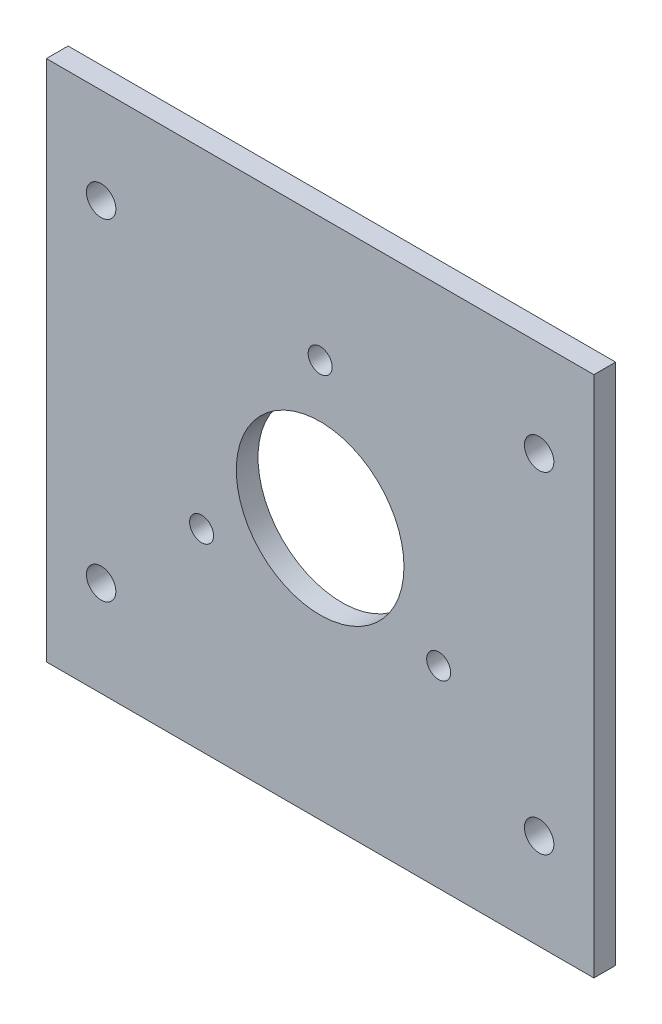
ISO-10303-21;
HEADER;
FILE_DESCRIPTION(('STEP AP214'),'2;1');
FILE_NAME('part.step','',(''),(''),'','','');
FILE_SCHEMA(('AUTOMOTIVE_DESIGN { 1 0 10303 214 1 1 1 1 }'));
ENDSEC;
DATA;
#1=APPLICATION_CONTEXT('core data for automotive mechanical design processes');
#2=APPLICATION_PROTOCOL_DEFINITION('international standard','automotive_design',2000,#1);
#3=PRODUCT_CONTEXT('',#1,'mechanical');
#4=PRODUCT('Part','Part','',(#3));
#5=PRODUCT_RELATED_PRODUCT_CATEGORY('part','',(#4));
#6=PRODUCT_DEFINITION_FORMATION('','',#4);
#7=PRODUCT_DEFINITION_CONTEXT('part definition',#1,'design');
#8=PRODUCT_DEFINITION('design','',#6,#7);
#9=PRODUCT_DEFINITION_SHAPE('','',#8);
#10=(LENGTH_UNIT() NAMED_UNIT(*) SI_UNIT(.MILLI.,.METRE.));
#11=(NAMED_UNIT(*) PLANE_ANGLE_UNIT() SI_UNIT($,.RADIAN.));
#12=(NAMED_UNIT(*) SI_UNIT($,.STERADIAN.) SOLID_ANGLE_UNIT());
#13=UNCERTAINTY_MEASURE_WITH_UNIT(LENGTH_MEASURE(1.E-05),#10,'distance_accuracy_value','');
#14=(GEOMETRIC_REPRESENTATION_CONTEXT(3) GLOBAL_UNCERTAINTY_ASSIGNED_CONTEXT((#13)) GLOBAL_UNIT_ASSIGNED_CONTEXT((#10,
#11,#12)) REPRESENTATION_CONTEXT('',''));
#15=CARTESIAN_POINT('',(0.,0.,0.));
#16=DIRECTION('',(0.,0.,1.));
#17=DIRECTION('',(1.,0.,0.));
#18=AXIS2_PLACEMENT_3D('',#15,#16,#17);
#19=CARTESIAN_POINT('',(0.,0.,3.175));
#20=DIRECTION('',(0.,0.,-1.));
#21=DIRECTION('',(-1.,0.,0.));
#22=AXIS2_PLACEMENT_3D('',#19,#20,#21);
#23=PLANE('',#22);
#24=DIRECTION('',(0.,1.,0.));
#25=VECTOR('',#24,1.);
#26=CARTESIAN_POINT('',(40.,-38.175,3.175));
#27=LINE('',#26,#25);
#28=CARTESIAN_POINT('',(40.,-38.175,3.175));
#29=VERTEX_POINT('',#28);
#30=CARTESIAN_POINT('',(40.,38.175,3.175));
#31=VERTEX_POINT('',#30);
#32=EDGE_CURVE('E98',#29,#31,#27,.T.);
#33=ORIENTED_EDGE('',*,*,#32,.T.);
#34=DIRECTION('',(-1.,0.,0.));
#35=VECTOR('',#34,1.);
#36=CARTESIAN_POINT('',(-40.,38.175,3.175));
#37=LINE('',#36,#35);
#38=CARTESIAN_POINT('',(-40.,38.175,3.175));
#39=VERTEX_POINT('',#38);
#40=EDGE_CURVE('E93',#31,#39,#37,.T.);
#41=ORIENTED_EDGE('',*,*,#40,.T.);
#42=DIRECTION('',(0.,-1.,0.));
#43=VECTOR('',#42,1.);
#44=CARTESIAN_POINT('',(-40.,-38.175,3.175));
#45=LINE('',#44,#43);
#46=CARTESIAN_POINT('',(-40.,-38.175,3.175));
#47=VERTEX_POINT('',#46);
#48=EDGE_CURVE('E96',#39,#47,#45,.T.);
#49=ORIENTED_EDGE('',*,*,#48,.T.);
#50=DIRECTION('',(1.,0.,0.));
#51=VECTOR('',#50,1.);
#52=CARTESIAN_POINT('',(-40.,-38.175,3.175));
#53=LINE('',#52,#51);
#54=EDGE_CURVE('E63',#47,#29,#53,.T.);
#55=ORIENTED_EDGE('',*,*,#54,.T.);
#56=EDGE_LOOP('',(#33,#41,#49,#55));
#57=FACE_BOUND('',#56,.T.);
#58=CARTESIAN_POINT('',(-32.,24.2,3.175));
#59=DIRECTION('',(0.,0.,1.));
#60=DIRECTION('',(1.,0.,0.));
#61=AXIS2_PLACEMENT_3D('',#58,#59,#60);
#62=CIRCLE('',#61,2.15);
#63=CARTESIAN_POINT('',(-29.85,24.2,3.175));
#64=VERTEX_POINT('',#63);
#65=EDGE_CURVE('E118',#64,#64,#62,.T.);
#66=ORIENTED_EDGE('',*,*,#65,.F.);
#67=EDGE_LOOP('',(#66));
#68=FACE_BOUND('',#67,.T.);
#69=CARTESIAN_POINT('',(17.3205080756906,-9.99999999999893,3.175));
#70=DIRECTION('',(0.,0.,1.));
#71=DIRECTION('',(1.,0.,0.));
#72=AXIS2_PLACEMENT_3D('',#69,#70,#71);
#73=CIRCLE('',#72,1.75);
#74=CARTESIAN_POINT('',(19.0705080756906,-9.99999999999893,3.175));
#75=VERTEX_POINT('',#74);
#76=EDGE_CURVE('E140',#75,#75,#73,.T.);
#77=ORIENTED_EDGE('',*,*,#76,.F.);
#78=EDGE_LOOP('',(#77));
#79=FACE_BOUND('',#78,.T.);
#80=CARTESIAN_POINT('',(-17.3205080756869,-10.0000000000011,3.175));
#81=DIRECTION('',(0.,0.,1.));
#82=DIRECTION('',(1.,0.,0.));
#83=AXIS2_PLACEMENT_3D('',#80,#81,#82);
#84=CIRCLE('',#83,1.75);
#85=CARTESIAN_POINT('',(-15.5705080756869,-10.0000000000011,3.175));
#86=VERTEX_POINT('',#85);
#87=EDGE_CURVE('E148',#86,#86,#84,.T.);
#88=ORIENTED_EDGE('',*,*,#87,.F.);
#89=EDGE_LOOP('',(#88));
#90=FACE_BOUND('',#89,.T.);
#91=CARTESIAN_POINT('',(32.,24.2,3.175));
#92=DIRECTION('',(0.,0.,1.));
#93=DIRECTION('',(-1.,0.,0.));
#94=AXIS2_PLACEMENT_3D('',#91,#92,#93);
#95=CIRCLE('',#94,2.15);
#96=CARTESIAN_POINT('',(29.85,24.2,3.175));
#97=VERTEX_POINT('',#96);
#98=EDGE_CURVE('E156',#97,#97,#95,.T.);
#99=ORIENTED_EDGE('',*,*,#98,.F.);
#100=EDGE_LOOP('',(#99));
#101=FACE_BOUND('',#100,.T.);
#102=CARTESIAN_POINT('',(32.,-24.2,3.175));
#103=DIRECTION('',(0.,0.,1.));
#104=DIRECTION('',(1.,0.,0.));
#105=AXIS2_PLACEMENT_3D('',#102,#103,#104);
#106=CIRCLE('',#105,2.15);
#107=CARTESIAN_POINT('',(34.15,-24.2,3.175));
#108=VERTEX_POINT('',#107);
#109=EDGE_CURVE('E164',#108,#108,#106,.T.);
#110=ORIENTED_EDGE('',*,*,#109,.F.);
#111=EDGE_LOOP('',(#110));
#112=FACE_BOUND('',#111,.T.);
#113=CARTESIAN_POINT('',(-32.,-24.2,3.175));
#114=DIRECTION('',(0.,0.,1.));
#115=DIRECTION('',(-1.,0.,0.));
#116=AXIS2_PLACEMENT_3D('',#113,#114,#115);
#117=CIRCLE('',#116,2.15);
#118=CARTESIAN_POINT('',(-34.15,-24.2,3.175));
#119=VERTEX_POINT('',#118);
#120=EDGE_CURVE('E172',#119,#119,#117,.T.);
#121=ORIENTED_EDGE('',*,*,#120,.F.);
#122=EDGE_LOOP('',(#121));
#123=FACE_BOUND('',#122,.T.);
#124=CARTESIAN_POINT('',(0.,20.,3.175));
#125=DIRECTION('',(0.,0.,1.));
#126=DIRECTION('',(1.,0.,0.));
#127=AXIS2_PLACEMENT_3D('',#124,#125,#126);
#128=CIRCLE('',#127,1.75);
#129=CARTESIAN_POINT('',(1.75,20.,3.175));
#130=VERTEX_POINT('',#129);
#131=EDGE_CURVE('E180',#130,#130,#128,.T.);
#132=ORIENTED_EDGE('',*,*,#131,.F.);
#133=EDGE_LOOP('',(#132));
#134=FACE_BOUND('',#133,.T.);
#135=CARTESIAN_POINT('',(0.,0.,3.175));
#136=DIRECTION('',(0.,0.,1.));
#137=DIRECTION('',(1.,0.,0.));
#138=AXIS2_PLACEMENT_3D('',#135,#136,#137);
#139=CIRCLE('',#138,12.25);
#140=CARTESIAN_POINT('',(12.25,0.,3.175));
#141=VERTEX_POINT('',#140);
#142=EDGE_CURVE('E188',#141,#141,#139,.T.);
#143=ORIENTED_EDGE('',*,*,#142,.F.);
#144=EDGE_LOOP('',(#143));
#145=FACE_BOUND('',#144,.T.);
#146=ADVANCED_FACE('F45',(#57,#68,#79,#90,#101,#112,#123,#134,#145),#23,.F.);
#147=CARTESIAN_POINT('',(0.,0.,0.));
#148=DIRECTION('',(0.,0.,-1.));
#149=DIRECTION('',(-1.,0.,0.));
#150=AXIS2_PLACEMENT_3D('',#147,#148,#149);
#151=PLANE('',#150);
#152=CARTESIAN_POINT('',(0.,20.,0.));
#153=DIRECTION('',(0.,0.,1.));
#154=DIRECTION('',(1.,0.,0.));
#155=AXIS2_PLACEMENT_3D('',#152,#153,#154);
#156=CIRCLE('',#155,1.75);
#157=CARTESIAN_POINT('',(1.75,20.,0.));
#158=VERTEX_POINT('',#157);
#159=EDGE_CURVE('E184',#158,#158,#156,.T.);
#160=ORIENTED_EDGE('',*,*,#159,.T.);
#161=EDGE_LOOP('',(#160));
#162=FACE_BOUND('',#161,.T.);
#163=CARTESIAN_POINT('',(32.,-24.2,0.));
#164=DIRECTION('',(0.,0.,1.));
#165=DIRECTION('',(1.,0.,0.));
#166=AXIS2_PLACEMENT_3D('',#163,#164,#165);
#167=CIRCLE('',#166,2.15);
#168=CARTESIAN_POINT('',(34.15,-24.2,0.));
#169=VERTEX_POINT('',#168);
#170=EDGE_CURVE('E168',#169,#169,#167,.T.);
#171=ORIENTED_EDGE('',*,*,#170,.T.);
#172=EDGE_LOOP('',(#171));
#173=FACE_BOUND('',#172,.T.);
#174=CARTESIAN_POINT('',(-17.3205080756869,-10.0000000000011,0.));
#175=DIRECTION('',(0.,0.,1.));
#176=DIRECTION('',(1.,0.,0.));
#177=AXIS2_PLACEMENT_3D('',#174,#175,#176);
#178=CIRCLE('',#177,1.75);
#179=CARTESIAN_POINT('',(-15.5705080756869,-10.0000000000011,0.));
#180=VERTEX_POINT('',#179);
#181=EDGE_CURVE('E152',#180,#180,#178,.T.);
#182=ORIENTED_EDGE('',*,*,#181,.T.);
#183=EDGE_LOOP('',(#182));
#184=FACE_BOUND('',#183,.T.);
#185=CARTESIAN_POINT('',(-32.,24.2,0.));
#186=DIRECTION('',(0.,0.,1.));
#187=DIRECTION('',(1.,0.,0.));
#188=AXIS2_PLACEMENT_3D('',#185,#186,#187);
#189=CIRCLE('',#188,2.15);
#190=CARTESIAN_POINT('',(-29.85,24.2,0.));
#191=VERTEX_POINT('',#190);
#192=EDGE_CURVE('E136',#191,#191,#189,.T.);
#193=ORIENTED_EDGE('',*,*,#192,.T.);
#194=EDGE_LOOP('',(#193));
#195=FACE_BOUND('',#194,.T.);
#196=DIRECTION('',(0.,1.,0.));
#197=VECTOR('',#196,1.);
#198=CARTESIAN_POINT('',(40.,-38.175,0.));
#199=LINE('',#198,#197);
#200=CARTESIAN_POINT('',(40.,-38.175,0.));
#201=VERTEX_POINT('',#200);
#202=CARTESIAN_POINT('',(40.,38.175,0.));
#203=VERTEX_POINT('',#202);
#204=EDGE_CURVE('E114',#201,#203,#199,.T.);
#205=ORIENTED_EDGE('',*,*,#204,.F.);
#206=DIRECTION('',(1.,0.,0.));
#207=VECTOR('',#206,1.);
#208=CARTESIAN_POINT('',(-40.,-38.175,0.));
#209=LINE('',#208,#207);
#210=CARTESIAN_POINT('',(-40.,-38.175,0.));
#211=VERTEX_POINT('',#210);
#212=EDGE_CURVE('E86',#211,#201,#209,.T.);
#213=ORIENTED_EDGE('',*,*,#212,.F.);
#214=DIRECTION('',(0.,-1.,0.));
#215=VECTOR('',#214,1.);
#216=CARTESIAN_POINT('',(-40.,-38.175,0.));
#217=LINE('',#216,#215);
#218=CARTESIAN_POINT('',(-40.,38.175,0.));
#219=VERTEX_POINT('',#218);
#220=EDGE_CURVE('E80',#219,#211,#217,.T.);
#221=ORIENTED_EDGE('',*,*,#220,.F.);
#222=DIRECTION('',(-1.,0.,0.));
#223=VECTOR('',#222,1.);
#224=CARTESIAN_POINT('',(-40.,38.175,0.));
#225=LINE('',#224,#223);
#226=EDGE_CURVE('E103',#203,#219,#225,.T.);
#227=ORIENTED_EDGE('',*,*,#226,.F.);
#228=EDGE_LOOP('',(#205,#213,#221,#227));
#229=FACE_BOUND('',#228,.T.);
#230=CARTESIAN_POINT('',(17.3205080756906,-9.99999999999893,0.));
#231=DIRECTION('',(0.,0.,1.));
#232=DIRECTION('',(1.,0.,0.));
#233=AXIS2_PLACEMENT_3D('',#230,#231,#232);
#234=CIRCLE('',#233,1.75);
#235=CARTESIAN_POINT('',(19.0705080756906,-9.99999999999893,0.));
#236=VERTEX_POINT('',#235);
#237=EDGE_CURVE('E144',#236,#236,#234,.T.);
#238=ORIENTED_EDGE('',*,*,#237,.T.);
#239=EDGE_LOOP('',(#238));
#240=FACE_BOUND('',#239,.T.);
#241=CARTESIAN_POINT('',(32.,24.2,0.));
#242=DIRECTION('',(0.,0.,1.));
#243=DIRECTION('',(-1.,0.,0.));
#244=AXIS2_PLACEMENT_3D('',#241,#242,#243);
#245=CIRCLE('',#244,2.15);
#246=CARTESIAN_POINT('',(29.85,24.2,0.));
#247=VERTEX_POINT('',#246);
#248=EDGE_CURVE('E160',#247,#247,#245,.T.);
#249=ORIENTED_EDGE('',*,*,#248,.T.);
#250=EDGE_LOOP('',(#249));
#251=FACE_BOUND('',#250,.T.);
#252=CARTESIAN_POINT('',(-32.,-24.2,0.));
#253=DIRECTION('',(0.,0.,1.));
#254=DIRECTION('',(-1.,0.,0.));
#255=AXIS2_PLACEMENT_3D('',#252,#253,#254);
#256=CIRCLE('',#255,2.15);
#257=CARTESIAN_POINT('',(-34.15,-24.2,0.));
#258=VERTEX_POINT('',#257);
#259=EDGE_CURVE('E176',#258,#258,#256,.T.);
#260=ORIENTED_EDGE('',*,*,#259,.T.);
#261=EDGE_LOOP('',(#260));
#262=FACE_BOUND('',#261,.T.);
#263=CARTESIAN_POINT('',(0.,0.,0.));
#264=DIRECTION('',(0.,0.,1.));
#265=DIRECTION('',(1.,0.,0.));
#266=AXIS2_PLACEMENT_3D('',#263,#264,#265);
#267=CIRCLE('',#266,12.25);
#268=CARTESIAN_POINT('',(12.25,0.,0.));
#269=VERTEX_POINT('',#268);
#270=EDGE_CURVE('E192',#269,#269,#267,.T.);
#271=ORIENTED_EDGE('',*,*,#270,.T.);
#272=EDGE_LOOP('',(#271));
#273=FACE_BOUND('',#272,.T.);
#274=ADVANCED_FACE('F131',(#162,#173,#184,#195,#229,#240,#251,#262,#273),#151,.T.);
#275=CARTESIAN_POINT('',(40.,-38.175,3.175));
#276=DIRECTION('',(-1.,0.,0.));
#277=DIRECTION('',(0.,0.,1.));
#278=AXIS2_PLACEMENT_3D('',#275,#276,#277);
#279=PLANE('',#278);
#280=ORIENTED_EDGE('',*,*,#204,.T.);
#281=DIRECTION('',(0.,0.,-1.));
#282=VECTOR('',#281,1.);
#283=CARTESIAN_POINT('',(40.,38.175,3.175));
#284=LINE('',#283,#282);
#285=EDGE_CURVE('E11',#31,#203,#284,.T.);
#286=ORIENTED_EDGE('',*,*,#285,.F.);
#287=ORIENTED_EDGE('',*,*,#32,.F.);
#288=DIRECTION('',(0.,0.,-1.));
#289=VECTOR('',#288,1.);
#290=CARTESIAN_POINT('',(40.,-38.175,3.175));
#291=LINE('',#290,#289);
#292=EDGE_CURVE('E110',#29,#201,#291,.T.);
#293=ORIENTED_EDGE('',*,*,#292,.T.);
#294=EDGE_LOOP('',(#280,#286,#287,#293));
#295=FACE_BOUND('',#294,.T.);
#296=ADVANCED_FACE('F47',(#295),#279,.F.);
#297=CARTESIAN_POINT('',(-40.,38.175,3.175));
#298=DIRECTION('',(0.,-1.,0.));
#299=DIRECTION('',(0.,0.,-1.));
#300=AXIS2_PLACEMENT_3D('',#297,#298,#299);
#301=PLANE('',#300);
#302=ORIENTED_EDGE('',*,*,#226,.T.);
#303=DIRECTION('',(0.,0.,-1.));
#304=VECTOR('',#303,1.);
#305=CARTESIAN_POINT('',(-40.,38.175,3.175));
#306=LINE('',#305,#304);
#307=EDGE_CURVE('E55',#39,#219,#306,.T.);
#308=ORIENTED_EDGE('',*,*,#307,.F.);
#309=ORIENTED_EDGE('',*,*,#40,.F.);
#310=ORIENTED_EDGE('',*,*,#285,.T.);
#311=EDGE_LOOP('',(#302,#308,#309,#310));
#312=FACE_BOUND('',#311,.T.);
#313=ADVANCED_FACE('F102',(#312),#301,.F.);
#314=CARTESIAN_POINT('',(-40.,-38.175,3.175));
#315=DIRECTION('',(1.,0.,0.));
#316=DIRECTION('',(0.,0.,-1.));
#317=AXIS2_PLACEMENT_3D('',#314,#315,#316);
#318=PLANE('',#317);
#319=ORIENTED_EDGE('',*,*,#220,.T.);
#320=DIRECTION('',(0.,0.,-1.));
#321=VECTOR('',#320,1.);
#322=CARTESIAN_POINT('',(-40.,-38.175,3.175));
#323=LINE('',#322,#321);
#324=EDGE_CURVE('E105',#47,#211,#323,.T.);
#325=ORIENTED_EDGE('',*,*,#324,.F.);
#326=ORIENTED_EDGE('',*,*,#48,.F.);
#327=ORIENTED_EDGE('',*,*,#307,.T.);
#328=EDGE_LOOP('',(#319,#325,#326,#327));
#329=FACE_BOUND('',#328,.T.);
#330=ADVANCED_FACE('F106',(#329),#318,.F.);
#331=CARTESIAN_POINT('',(-40.,-38.175,3.175));
#332=DIRECTION('',(0.,1.,0.));
#333=DIRECTION('',(0.,0.,1.));
#334=AXIS2_PLACEMENT_3D('',#331,#332,#333);
#335=PLANE('',#334);
#336=ORIENTED_EDGE('',*,*,#212,.T.);
#337=ORIENTED_EDGE('',*,*,#292,.F.);
#338=ORIENTED_EDGE('',*,*,#54,.F.);
#339=ORIENTED_EDGE('',*,*,#324,.T.);
#340=EDGE_LOOP('',(#336,#337,#338,#339));
#341=FACE_BOUND('',#340,.T.);
#342=ADVANCED_FACE('F128',(#341),#335,.F.);
#343=CARTESIAN_POINT('',(-32.,24.2,3.175));
#344=DIRECTION('',(0.,0.,-1.));
#345=DIRECTION('',(-1.,0.,0.));
#346=AXIS2_PLACEMENT_3D('',#343,#344,#345);
#347=CYLINDRICAL_SURFACE('',#346,2.15);
#348=ORIENTED_EDGE('',*,*,#65,.T.);
#349=EDGE_LOOP('',(#348));
#350=FACE_BOUND('',#349,.T.);
#351=ORIENTED_EDGE('',*,*,#192,.F.);
#352=EDGE_LOOP('',(#351));
#353=FACE_BOUND('',#352,.T.);
#354=ADVANCED_FACE('F211',(#350,#353),#347,.F.);
#355=CARTESIAN_POINT('',(17.3205080756906,-9.99999999999893,3.175));
#356=DIRECTION('',(0.,0.,-1.));
#357=DIRECTION('',(-1.,0.,0.));
#358=AXIS2_PLACEMENT_3D('',#355,#356,#357);
#359=CYLINDRICAL_SURFACE('',#358,1.75);
#360=ORIENTED_EDGE('',*,*,#76,.T.);
#361=EDGE_LOOP('',(#360));
#362=FACE_BOUND('',#361,.T.);
#363=ORIENTED_EDGE('',*,*,#237,.F.);
#364=EDGE_LOOP('',(#363));
#365=FACE_BOUND('',#364,.T.);
#366=ADVANCED_FACE('F256',(#362,#365),#359,.F.);
#367=CARTESIAN_POINT('',(-17.3205080756869,-10.0000000000011,3.175));
#368=DIRECTION('',(0.,0.,-1.));
#369=DIRECTION('',(-1.,0.,0.));
#370=AXIS2_PLACEMENT_3D('',#367,#368,#369);
#371=CYLINDRICAL_SURFACE('',#370,1.75);
#372=ORIENTED_EDGE('',*,*,#87,.T.);
#373=EDGE_LOOP('',(#372));
#374=FACE_BOUND('',#373,.T.);
#375=ORIENTED_EDGE('',*,*,#181,.F.);
#376=EDGE_LOOP('',(#375));
#377=FACE_BOUND('',#376,.T.);
#378=ADVANCED_FACE('F264',(#374,#377),#371,.F.);
#379=CARTESIAN_POINT('',(32.,24.2,3.175));
#380=DIRECTION('',(0.,0.,-1.));
#381=DIRECTION('',(-1.,0.,0.));
#382=AXIS2_PLACEMENT_3D('',#379,#380,#381);
#383=CYLINDRICAL_SURFACE('',#382,2.15);
#384=ORIENTED_EDGE('',*,*,#98,.T.);
#385=EDGE_LOOP('',(#384));
#386=FACE_BOUND('',#385,.T.);
#387=ORIENTED_EDGE('',*,*,#248,.F.);
#388=EDGE_LOOP('',(#387));
#389=FACE_BOUND('',#388,.T.);
#390=ADVANCED_FACE('F272',(#386,#389),#383,.F.);
#391=CARTESIAN_POINT('',(32.,-24.2,3.175));
#392=DIRECTION('',(0.,0.,-1.));
#393=DIRECTION('',(-1.,0.,0.));
#394=AXIS2_PLACEMENT_3D('',#391,#392,#393);
#395=CYLINDRICAL_SURFACE('',#394,2.15);
#396=ORIENTED_EDGE('',*,*,#109,.T.);
#397=EDGE_LOOP('',(#396));
#398=FACE_BOUND('',#397,.T.);
#399=ORIENTED_EDGE('',*,*,#170,.F.);
#400=EDGE_LOOP('',(#399));
#401=FACE_BOUND('',#400,.T.);
#402=ADVANCED_FACE('F281',(#398,#401),#395,.F.);
#403=CARTESIAN_POINT('',(-32.,-24.2,3.175));
#404=DIRECTION('',(0.,0.,-1.));
#405=DIRECTION('',(-1.,0.,0.));
#406=AXIS2_PLACEMENT_3D('',#403,#404,#405);
#407=CYLINDRICAL_SURFACE('',#406,2.15);
#408=ORIENTED_EDGE('',*,*,#120,.T.);
#409=EDGE_LOOP('',(#408));
#410=FACE_BOUND('',#409,.T.);
#411=ORIENTED_EDGE('',*,*,#259,.F.);
#412=EDGE_LOOP('',(#411));
#413=FACE_BOUND('',#412,.T.);
#414=ADVANCED_FACE('F290',(#410,#413),#407,.F.);
#415=CARTESIAN_POINT('',(0.,20.,3.175));
#416=DIRECTION('',(0.,0.,-1.));
#417=DIRECTION('',(-1.,0.,0.));
#418=AXIS2_PLACEMENT_3D('',#415,#416,#417);
#419=CYLINDRICAL_SURFACE('',#418,1.75);
#420=ORIENTED_EDGE('',*,*,#131,.T.);
#421=EDGE_LOOP('',(#420));
#422=FACE_BOUND('',#421,.T.);
#423=ORIENTED_EDGE('',*,*,#159,.F.);
#424=EDGE_LOOP('',(#423));
#425=FACE_BOUND('',#424,.T.);
#426=ADVANCED_FACE('F299',(#422,#425),#419,.F.);
#427=CARTESIAN_POINT('',(0.,0.,3.175));
#428=DIRECTION('',(0.,0.,-1.));
#429=DIRECTION('',(-1.,0.,0.));
#430=AXIS2_PLACEMENT_3D('',#427,#428,#429);
#431=CYLINDRICAL_SURFACE('',#430,12.25);
#432=ORIENTED_EDGE('',*,*,#142,.T.);
#433=EDGE_LOOP('',(#432));
#434=FACE_BOUND('',#433,.T.);
#435=ORIENTED_EDGE('',*,*,#270,.F.);
#436=EDGE_LOOP('',(#435));
#437=FACE_BOUND('',#436,.T.);
#438=ADVANCED_FACE('F200',(#434,#437),#431,.F.);
#439=CLOSED_SHELL('',(#146,#274,#296,#313,#330,#342,#354,#366,#378,#390,#402,#414,#426,#438));
#440=MANIFOLD_SOLID_BREP('B2',#439);
#441=ADVANCED_BREP_SHAPE_REPRESENTATION('',(#18,#440),#14);
#442=SHAPE_DEFINITION_REPRESENTATION(#9,#441);
ENDSEC;
END-ISO-10303-21;
